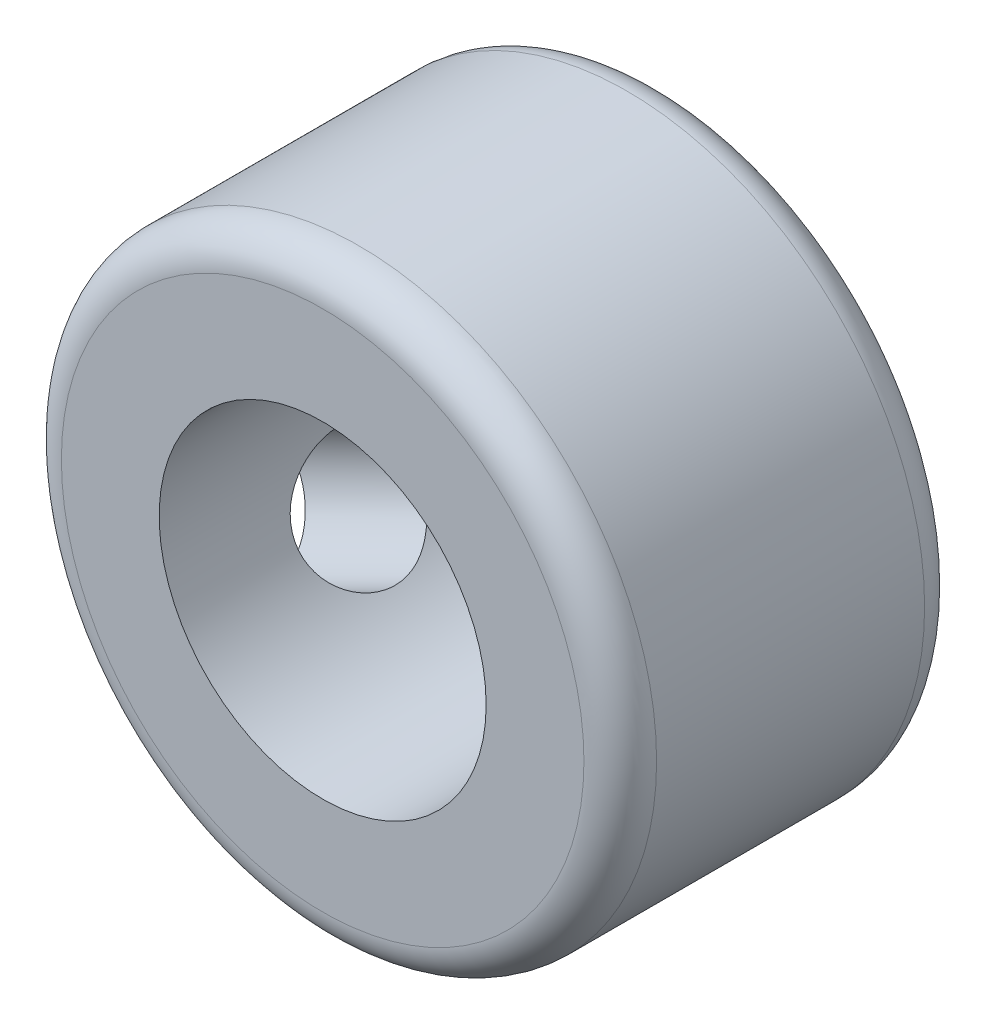
ISO-10303-21;
HEADER;
FILE_DESCRIPTION(('STEP AP214'),'2;1');
FILE_NAME('part.step','',(''),(''),'','','');
FILE_SCHEMA(('AUTOMOTIVE_DESIGN { 1 0 10303 214 1 1 1 1 }'));
ENDSEC;
DATA;
#1=APPLICATION_CONTEXT('core data for automotive mechanical design processes');
#2=APPLICATION_PROTOCOL_DEFINITION('international standard','automotive_design',2000,#1);
#3=PRODUCT_CONTEXT('',#1,'mechanical');
#4=PRODUCT('Part','Part','',(#3));
#5=PRODUCT_RELATED_PRODUCT_CATEGORY('part','',(#4));
#6=PRODUCT_DEFINITION_FORMATION('','',#4);
#7=PRODUCT_DEFINITION_CONTEXT('part definition',#1,'design');
#8=PRODUCT_DEFINITION('design','',#6,#7);
#9=PRODUCT_DEFINITION_SHAPE('','',#8);
#10=(LENGTH_UNIT() NAMED_UNIT(*) SI_UNIT(.MILLI.,.METRE.));
#11=(NAMED_UNIT(*) PLANE_ANGLE_UNIT() SI_UNIT($,.RADIAN.));
#12=(NAMED_UNIT(*) SI_UNIT($,.STERADIAN.) SOLID_ANGLE_UNIT());
#13=UNCERTAINTY_MEASURE_WITH_UNIT(LENGTH_MEASURE(1.E-05),#10,'distance_accuracy_value','');
#14=(GEOMETRIC_REPRESENTATION_CONTEXT(3) GLOBAL_UNCERTAINTY_ASSIGNED_CONTEXT((#13)) GLOBAL_UNIT_ASSIGNED_CONTEXT((#10,
#11,#12)) REPRESENTATION_CONTEXT('',''));
#15=CARTESIAN_POINT('',(0.,0.,0.));
#16=DIRECTION('',(0.,0.,1.));
#17=DIRECTION('',(1.,0.,0.));
#18=AXIS2_PLACEMENT_3D('',#15,#16,#17);
#19=CARTESIAN_POINT('',(0.,0.,7.14502));
#20=DIRECTION('',(0.,0.,1.));
#21=DIRECTION('',(1.,0.,0.));
#22=AXIS2_PLACEMENT_3D('',#19,#20,#21);
#23=PLANE('',#22);
#24=CARTESIAN_POINT('',(0.,0.,7.14502));
#25=DIRECTION('',(0.,0.,1.));
#26=DIRECTION('',(1.,0.,0.));
#27=AXIS2_PLACEMENT_3D('',#24,#25,#26);
#28=CIRCLE('',#27,5.48005);
#29=CARTESIAN_POINT('',(5.48005,0.,7.14502));
#30=VERTEX_POINT('',#29);
#31=EDGE_CURVE('E10',#30,#30,#28,.T.);
#32=ORIENTED_EDGE('',*,*,#31,.T.);
#33=EDGE_LOOP('',(#32));
#34=FACE_BOUND('',#33,.T.);
#35=CARTESIAN_POINT('',(0.,0.,7.14502));
#36=DIRECTION('',(0.,0.,1.));
#37=DIRECTION('',(1.,0.,0.));
#38=AXIS2_PLACEMENT_3D('',#35,#36,#37);
#39=CIRCLE('',#38,3.429);
#40=CARTESIAN_POINT('',(3.429,0.,7.14502));
#41=VERTEX_POINT('',#40);
#42=EDGE_CURVE('E52',#41,#41,#39,.T.);
#43=ORIENTED_EDGE('',*,*,#42,.F.);
#44=EDGE_LOOP('',(#43));
#45=FACE_BOUND('',#44,.T.);
#46=ADVANCED_FACE('F32',(#34,#45),#23,.T.);
#47=CARTESIAN_POINT('',(0.,0.,0.));
#48=DIRECTION('',(0.,0.,1.));
#49=DIRECTION('',(1.,0.,0.));
#50=AXIS2_PLACEMENT_3D('',#47,#48,#49);
#51=PLANE('',#50);
#52=CARTESIAN_POINT('',(0.,0.,0.));
#53=DIRECTION('',(0.,0.,1.));
#54=DIRECTION('',(1.,0.,0.));
#55=AXIS2_PLACEMENT_3D('',#52,#53,#54);
#56=CIRCLE('',#55,5.48005);
#57=CARTESIAN_POINT('',(5.48005,0.,0.));
#58=VERTEX_POINT('',#57);
#59=EDGE_CURVE('E39',#58,#58,#56,.F.);
#60=ORIENTED_EDGE('',*,*,#59,.T.);
#61=EDGE_LOOP('',(#60));
#62=FACE_BOUND('',#61,.T.);
#63=CARTESIAN_POINT('',(0.,0.,0.));
#64=DIRECTION('',(0.,0.,1.));
#65=DIRECTION('',(1.,0.,0.));
#66=AXIS2_PLACEMENT_3D('',#63,#64,#65);
#67=CIRCLE('',#66,3.429);
#68=CARTESIAN_POINT('',(3.429,0.,0.));
#69=VERTEX_POINT('',#68);
#70=EDGE_CURVE('E53',#69,#69,#67,.T.);
#71=ORIENTED_EDGE('',*,*,#70,.T.);
#72=EDGE_LOOP('',(#71));
#73=FACE_BOUND('',#72,.T.);
#74=ADVANCED_FACE('F87',(#62,#73),#51,.F.);
#75=CARTESIAN_POINT('',(0.,0.,7.14502));
#76=DIRECTION('',(0.,0.,-1.));
#77=DIRECTION('',(-1.,0.,0.));
#78=AXIS2_PLACEMENT_3D('',#75,#76,#77);
#79=CYLINDRICAL_SURFACE('',#78,6.24205);
#80=CARTESIAN_POINT('',(-4.89555906178153,-3.8725559615206,3.35964754371703));
#81=CARTESIAN_POINT('',(-4.89556151127646,-3.872554282031,3.28748073868206));
#82=CARTESIAN_POINT('',(-4.89939232881785,-3.86772516455889,3.21528194832226));
#83=CARTESIAN_POINT('',(-4.91450221139038,-3.84850621838423,3.07293144813282));
#84=CARTESIAN_POINT('',(-4.92578698788261,-3.83410905829038,3.00278135115123));
#85=CARTESIAN_POINT('',(-4.95515144976803,-3.7960815297565,2.86660814231961));
#86=CARTESIAN_POINT('',(-4.97322407662432,-3.77246075174592,2.80058082617589));
#87=CARTESIAN_POINT('',(-5.0152020682944,-3.71647081147953,2.67436023219772));
#88=CARTESIAN_POINT('',(-5.03910719661983,-3.68410200392124,2.6141667179604));
#89=CARTESIAN_POINT('',(-5.09193282424291,-3.6107441996903,2.50039776339189));
#90=CARTESIAN_POINT('',(-5.1209177868462,-3.56964275697667,2.44692474276671));
#91=CARTESIAN_POINT('',(-5.18230843167619,-3.47991625769416,2.34901005020034));
#92=CARTESIAN_POINT('',(-5.21471436443174,-3.43129064998442,2.30456904040099));
#93=CARTESIAN_POINT('',(-5.28184104643445,-3.32704328260817,2.22557911585089));
#94=CARTESIAN_POINT('',(-5.31658083892124,-3.27135952972142,2.19112804226269));
#95=CARTESIAN_POINT('',(-5.38663410625901,-3.15467677967938,2.13372798942026));
#96=CARTESIAN_POINT('',(-5.42194752245468,-3.0936783232248,2.11077784169936));
#97=CARTESIAN_POINT('',(-5.49127614278697,-2.96885441069911,2.07735137050192));
#98=CARTESIAN_POINT('',(-5.52530267641748,-2.9050816384348,2.06670192282013));
#99=CARTESIAN_POINT('',(-5.59142075156206,-2.77569410404554,2.05763851610217));
#100=CARTESIAN_POINT('',(-5.62351249423381,-2.71007953445303,2.05922328287226));
#101=CARTESIAN_POINT('',(-5.68437006800754,-2.57996261200605,2.07445303115628));
#102=CARTESIAN_POINT('',(-5.71317959048657,-2.51545872461515,2.08791147821499));
#103=CARTESIAN_POINT('',(-5.76743235138648,-2.38844811085704,2.12621008797153));
#104=CARTESIAN_POINT('',(-5.79287544723976,-2.32594146915784,2.15105073250482));
#105=CARTESIAN_POINT('',(-5.84021998489538,-2.20438343410889,2.21157802834788));
#106=CARTESIAN_POINT('',(-5.86209637041905,-2.14535820153378,2.24733673368159));
#107=CARTESIAN_POINT('',(-5.90200013783265,-2.03301303102962,2.32863160275434));
#108=CARTESIAN_POINT('',(-5.92002704093151,-1.97969380321319,2.37416898133452));
#109=CARTESIAN_POINT('',(-5.95261128199984,-1.87947880535448,2.4747485606788));
#110=CARTESIAN_POINT('',(-5.96709666595797,-1.83272336252475,2.52995402335311));
#111=CARTESIAN_POINT('',(-5.9923382394645,-1.7484314171397,2.64776553136598));
#112=CARTESIAN_POINT('',(-6.00309434605521,-1.71089511966948,2.71037174129247));
#113=CARTESIAN_POINT('',(-6.02112717400421,-1.64631349479915,2.84144626419913));
#114=CARTESIAN_POINT('',(-6.02839520738967,-1.61929439453963,2.90992871905162));
#115=CARTESIAN_POINT('',(-6.03961367720531,-1.57694001227056,3.0506728750738));
#116=CARTESIAN_POINT('',(-6.0435645860549,-1.56160306653663,3.12293403652859));
#117=CARTESIAN_POINT('',(-6.04823523901426,-1.5434138086052,3.26775019727472));
#118=CARTESIAN_POINT('',(-6.04901348520437,-1.54033547948423,3.34027495436418));
#119=CARTESIAN_POINT('',(-6.04752566605425,-1.54616632516086,3.48480582407927));
#120=CARTESIAN_POINT('',(-6.04525978893094,-1.55507475882179,3.55681196849377));
#121=CARTESIAN_POINT('',(-6.03765037231767,-1.58435750736785,3.69748166850601));
#122=CARTESIAN_POINT('',(-6.03233952755465,-1.60460996563629,3.76617245830743));
#123=CARTESIAN_POINT('',(-6.01851134926159,-1.6557191527901,3.8991431618127));
#124=CARTESIAN_POINT('',(-6.00999373284155,-1.68657681720817,3.9634226857787));
#125=CARTESIAN_POINT('',(-5.98940533365221,-1.75829981031248,4.08674140592178));
#126=CARTESIAN_POINT('',(-5.97728628386192,-1.79929972821048,4.14569423034264));
#127=CARTESIAN_POINT('',(-5.94932966390241,-1.88968181758753,4.25577824880108));
#128=CARTESIAN_POINT('',(-5.9334916770325,-1.93906492821744,4.30690856527858));
#129=CARTESIAN_POINT('',(-5.89764823398908,-2.0455155868203,4.40077144659245));
#130=CARTESIAN_POINT('',(-5.87757739338311,-2.10269803198287,4.44334894026558));
#131=CARTESIAN_POINT('',(-5.83342360874218,-2.22225379898614,4.51779377005767));
#132=CARTESIAN_POINT('',(-5.8093408419806,-2.28462689140886,4.54966157921355));
#133=CARTESIAN_POINT('',(-5.75753321870572,-2.4121994308606,4.6015607182477));
#134=CARTESIAN_POINT('',(-5.72983136993394,-2.47737941200989,4.62166275901407));
#135=CARTESIAN_POINT('',(-5.67116586807328,-2.60887803237933,4.64968247852203));
#136=CARTESIAN_POINT('',(-5.64020264325804,-2.67519652113928,4.65760175493985));
#137=CARTESIAN_POINT('',(-5.57641575798782,-2.8056999652772,4.66096496177949));
#138=CARTESIAN_POINT('',(-5.54363819022821,-2.86990157069485,4.65664132525036));
#139=CARTESIAN_POINT('',(-5.47671282305758,-2.99564327647339,4.6361575316094));
#140=CARTESIAN_POINT('',(-5.44256504395452,-3.05718341625191,4.61999754986337));
#141=CARTESIAN_POINT('',(-5.37419121563277,-3.17583646504283,4.57640665668795));
#142=CARTESIAN_POINT('',(-5.33996561663927,-3.23296072153121,4.54900585821135));
#143=CARTESIAN_POINT('',(-5.27264801500482,-3.34162555577781,4.48374166827042));
#144=CARTESIAN_POINT('',(-5.23955611127441,-3.39316564718325,4.44587736650547));
#145=CARTESIAN_POINT('',(-5.17530073534086,-3.49040252928673,4.35998818957931));
#146=CARTESIAN_POINT('',(-5.14418075206696,-3.53598225227065,4.31179822746916));
#147=CARTESIAN_POINT('',(-5.08590405098134,-3.61930374729544,4.20696224804262));
#148=CARTESIAN_POINT('',(-5.0587482798609,-3.65704364802003,4.15031421737171));
#149=CARTESIAN_POINT('',(-5.00942865320613,-3.72432251391559,4.02936249043176));
#150=CARTESIAN_POINT('',(-4.98732787378027,-3.753758823153,3.96497590752718));
#151=CARTESIAN_POINT('',(-4.94973576260537,-3.80319288505781,3.83091159021136));
#152=CARTESIAN_POINT('',(-4.93423860778763,-3.82319895495986,3.76123858150894));
#153=CARTESIAN_POINT('',(-4.91360522243457,-3.84965906237777,3.63614458969436));
#154=CARTESIAN_POINT('',(-4.90685957827449,-3.85823411465976,3.58142266905371));
#155=CARTESIAN_POINT('',(-4.89783564251892,-3.86968309771862,3.4710226718279));
#156=CARTESIAN_POINT('',(-4.89555717130378,-3.87255725772157,3.41534463377788));
#157=CARTESIAN_POINT('',(-4.89555906178153,-3.8725559615206,3.35964754371703));
#158=B_SPLINE_CURVE_WITH_KNOTS('',3,(#80,#81,#82,#83,#84,#85,#86,#87,#88,#89,#90,#91,#92,#93,
#94,#95,#96,#97,#98,#99,#100,#101,#102,#103,#104,#105,#106,#107,#108,#109,#110,#111,#112,#113,
#114,#115,#116,#117,#118,#119,#120,#121,#122,#123,#124,#125,#126,#127,#128,#129,#130,#131,#132,
#133,#134,#135,#136,#137,#138,#139,#140,#141,#142,#143,#144,#145,#146,#147,#148,#149,#150,#151,
#152,#153,#154,#155,#156,#157),.UNSPECIFIED.,.T.,.F.,(4,2,2,2,2,2,2,2,2,2,2,2,2,2,2,2,2,2,2,2,2,
2,2,2,2,2,2,2,2,2,2,2,2,2,2,2,2,2,4),(0.,0.216296401042701,0.432758727840282,0.648996580631314,
0.865225667159785,1.08442897131557,1.3036483395978,1.5249473404376,1.74622385326547,
1.96434656690035,2.18244656335566,2.39718005151517,2.61192263069345,2.82811421723303,
3.04433267761608,3.26463453307644,3.48494128883226,3.7057939652596,3.92661518287352,
4.14334564382506,4.36006270503604,4.57449526015904,4.78894673619443,5.00641296606696,
5.22390357430526,5.44503851773163,5.66616369254684,5.88594591089351,6.10569930402802,
6.32130878149514,6.5369150645843,6.75194749441027,6.96699863745356,7.18578575589877,
7.40462503759842,7.62606178264249,7.84730285890275,8.01424338718197,8.1811772028452),.UNSPECIFIED.);
#159=CARTESIAN_POINT('',(-4.89555906178153,-3.8725559615206,3.35964754371703));
#160=VERTEX_POINT('',#159);
#161=EDGE_CURVE('E56',#160,#160,#158,.T.);
#162=ORIENTED_EDGE('',*,*,#161,.T.);
#163=EDGE_LOOP('',(#162));
#164=FACE_BOUND('',#163,.T.);
#165=CARTESIAN_POINT('',(0.,0.,0.762));
#166=DIRECTION('',(0.,0.,1.));
#167=DIRECTION('',(1.,0.,0.));
#168=AXIS2_PLACEMENT_3D('',#165,#166,#167);
#169=CIRCLE('',#168,6.24205);
#170=CARTESIAN_POINT('',(6.24205,0.,0.762));
#171=VERTEX_POINT('',#170);
#172=EDGE_CURVE('E43',#171,#171,#169,.T.);
#173=ORIENTED_EDGE('',*,*,#172,.T.);
#174=EDGE_LOOP('',(#173));
#175=FACE_BOUND('',#174,.T.);
#176=CARTESIAN_POINT('',(0.,0.,6.38302));
#177=DIRECTION('',(0.,0.,1.));
#178=DIRECTION('',(1.,0.,0.));
#179=AXIS2_PLACEMENT_3D('',#176,#177,#178);
#180=CIRCLE('',#179,6.24205);
#181=CARTESIAN_POINT('',(6.24205,0.,6.38302));
#182=VERTEX_POINT('',#181);
#183=EDGE_CURVE('E47',#182,#182,#180,.F.);
#184=ORIENTED_EDGE('',*,*,#183,.T.);
#185=EDGE_LOOP('',(#184));
#186=FACE_BOUND('',#185,.T.);
#187=ADVANCED_FACE('F71',(#164,#175,#186),#79,.T.);
#188=CARTESIAN_POINT('',(0.,0.,7.14502));
#189=DIRECTION('',(0.,0.,-1.));
#190=DIRECTION('',(-1.,0.,0.));
#191=AXIS2_PLACEMENT_3D('',#188,#189,#190);
#192=CYLINDRICAL_SURFACE('',#191,3.429);
#193=CARTESIAN_POINT('',(-2.26747407947061,-2.57227570429939,3.35964754371703));
#194=CARTESIAN_POINT('',(-2.26747030842872,-2.57227709940115,3.28950484390039));
#195=CARTESIAN_POINT('',(-2.27210714909908,-2.5682132239097,3.21938114689891));
#196=CARTESIAN_POINT('',(-2.29025132017933,-2.55204548218884,3.08125166189923));
#197=CARTESIAN_POINT('',(-2.30375823350285,-2.53994199399581,3.0132457744754));
#198=CARTESIAN_POINT('',(-2.33854743676144,-2.50794490039064,2.88138663583295));
#199=CARTESIAN_POINT('',(-2.35981072047008,-2.48807032877012,2.81752367953077));
#200=CARTESIAN_POINT('',(-2.40868240703513,-2.44078727640553,2.69524959509066));
#201=CARTESIAN_POINT('',(-2.43629275953771,-2.41337648023102,2.6368401498904));
#202=CARTESIAN_POINT('',(-2.49765471723843,-2.34985035411838,2.52416232244925));
#203=CARTESIAN_POINT('',(-2.53163119253578,-2.31339124926917,2.47021013305066));
#204=CARTESIAN_POINT('',(-2.60293153967425,-2.23286320335768,2.37085487488544));
#205=CARTESIAN_POINT('',(-2.64025614333647,-2.18879259664491,2.32545368191773));
#206=CARTESIAN_POINT('',(-2.71773540027253,-2.09187262124716,2.24295650017647));
#207=CARTESIAN_POINT('',(-2.75794335785931,-2.03877062001819,2.20620552571719));
#208=CARTESIAN_POINT('',(-2.83792910271802,-1.92587002109268,2.14436342783691));
#209=CARTESIAN_POINT('',(-2.87770703782665,-1.86607381062406,2.11926816419621));
#210=CARTESIAN_POINT('',(-2.95322634739953,-1.74396640083232,2.08256277335286));
#211=CARTESIAN_POINT('',(-2.98906831525229,-1.68188155114414,2.07040799382833));
#212=CARTESIAN_POINT('',(-3.05717487121117,-1.55464549717725,2.05818205740226));
#213=CARTESIAN_POINT('',(-3.08944064470829,-1.48949531921581,2.05810688446549));
#214=CARTESIAN_POINT('',(-3.14785107348823,-1.36153406787455,2.0697281173022));
#215=CARTESIAN_POINT('',(-3.17422269913715,-1.29877122619699,2.08082967563692));
#216=CARTESIAN_POINT('',(-3.22237566729219,-1.1742215638033,2.11348681492332));
#217=CARTESIAN_POINT('',(-3.24415668381279,-1.11243481268871,2.13504313792375));
#218=CARTESIAN_POINT('',(-3.28338077333767,-0.990757932919237,2.18826719822349));
#219=CARTESIAN_POINT('',(-3.30075559008604,-0.930908873472572,2.22007849972881));
#220=CARTESIAN_POINT('',(-3.33108052408566,-0.815777634892501,2.29278130487117));
#221=CARTESIAN_POINT('',(-3.34402919371209,-0.760496954376234,2.3336757720663));
#222=CARTESIAN_POINT('',(-3.36673220498142,-0.652958311756335,2.4262355387693));
#223=CARTESIAN_POINT('',(-3.37624980814135,-0.601077601637,2.47839796486429));
#224=CARTESIAN_POINT('',(-3.39180823447309,-0.505969974224323,2.59057042011697));
#225=CARTESIAN_POINT('',(-3.39784814495695,-0.462745330574132,2.65058250427769));
#226=CARTESIAN_POINT('',(-3.40745577216126,-0.38578494560052,2.77853632089886));
#227=CARTESIAN_POINT('',(-3.41096309527068,-0.352291725955157,2.84662932320014));
#228=CARTESIAN_POINT('',(-3.41614744830987,-0.297881817307615,2.98772726601331));
#229=CARTESIAN_POINT('',(-3.41782552424842,-0.276957943918749,3.06072937399295));
#230=CARTESIAN_POINT('',(-3.41992057242502,-0.249722962608799,3.20518700053376));
#231=CARTESIAN_POINT('',(-3.42040307757978,-0.242657172894765,3.27649911913703));
#232=CARTESIAN_POINT('',(-3.42050198542265,-0.241266290139215,3.4192385565834));
#233=CARTESIAN_POINT('',(-3.42011861150782,-0.246937910839832,3.49066584096246));
#234=CARTESIAN_POINT('',(-3.41836484617287,-0.270081466137236,3.627942351259));
#235=CARTESIAN_POINT('',(-3.41704368174664,-0.286962259342676,3.69389348448609));
#236=CARTESIAN_POINT('',(-3.41305161392389,-0.331068691412498,3.82219035413684));
#237=CARTESIAN_POINT('',(-3.41038043026801,-0.358296477986002,3.88453533894025));
#238=CARTESIAN_POINT('',(-3.40295341719503,-0.423142600645084,4.00648713738159));
#239=CARTESIAN_POINT('',(-3.39812219949659,-0.46111658863015,4.06589975938463));
#240=CARTESIAN_POINT('',(-3.38559856683993,-0.54550973849413,4.1780608540603));
#241=CARTESIAN_POINT('',(-3.37790508390184,-0.591932049338231,4.23080682939278));
#242=CARTESIAN_POINT('',(-3.35826936370743,-0.694974346283289,4.33169774799338));
#243=CARTESIAN_POINT('',(-3.34608330117401,-0.752061253500244,4.37932020363114));
#244=CARTESIAN_POINT('',(-3.31679110427455,-0.87221355611712,4.46446165808167));
#245=CARTESIAN_POINT('',(-3.29968492738867,-0.935279003180698,4.50198056957372));
#246=CARTESIAN_POINT('',(-3.26008288300493,-1.06512354355151,4.56561813070751));
#247=CARTESIAN_POINT('',(-3.23760336841212,-1.13189090606928,4.59177070425396));
#248=CARTESIAN_POINT('',(-3.18715115261084,-1.26700328841857,4.63180965104158));
#249=CARTESIAN_POINT('',(-3.15918110516235,-1.335347532063,4.64570193233887));
#250=CARTESIAN_POINT('',(-3.1000617057627,-1.46716249340065,4.66017841322985));
#251=CARTESIAN_POINT('',(-3.06920003413211,-1.53068148491115,4.66150434909939));
#252=CARTESIAN_POINT('',(-3.00395676004415,-1.65505713492336,4.6527266340656));
#253=CARTESIAN_POINT('',(-2.96957559860035,-1.71591412562932,4.6426244135895));
#254=CARTESIAN_POINT('',(-2.89947234074163,-1.83182360225129,4.6117998476018));
#255=CARTESIAN_POINT('',(-2.86380640121553,-1.88698418603053,4.59135346707571));
#256=CARTESIAN_POINT('',(-2.79172607793569,-1.99207708949328,4.54069812907696));
#257=CARTESIAN_POINT('',(-2.75531155365101,-2.04200841657181,4.51048732257532));
#258=CARTESIAN_POINT('',(-2.68168620393303,-2.13785113701048,4.43970394703373));
#259=CARTESIAN_POINT('',(-2.64450718713281,-2.18350193460519,4.39874598642105));
#260=CARTESIAN_POINT('',(-2.57265562102337,-2.26771994676495,4.30823396638923));
#261=CARTESIAN_POINT('',(-2.53798398046439,-2.30628460081905,4.25867681226003));
#262=CARTESIAN_POINT('',(-2.47111626801636,-2.37784666240351,4.14917992632863));
#263=CARTESIAN_POINT('',(-2.43915639465308,-2.41042877044321,4.08882290338991));
#264=CARTESIAN_POINT('',(-2.38197617098747,-2.46695216493545,3.96122923617527));
#265=CARTESIAN_POINT('',(-2.35675681057706,-2.49089218241675,3.89399158343311));
#266=CARTESIAN_POINT('',(-2.31383307883098,-2.5308363507088,3.75064972617516));
#267=CARTESIAN_POINT('',(-2.29660136218249,-2.54634903569742,3.67426387271674));
#268=CARTESIAN_POINT('',(-2.27342795959135,-2.56706430395349,3.51845829899826));
#269=CARTESIAN_POINT('',(-2.26747834784212,-2.5722741252099,3.43904074858084));
#270=CARTESIAN_POINT('',(-2.26747407947061,-2.57227570429939,3.35964754371703));
#271=B_SPLINE_CURVE_WITH_KNOTS('',3,(#193,#194,#195,#196,#197,#198,#199,#200,#201,#202,#203,
#204,#205,#206,#207,#208,#209,#210,#211,#212,#213,#214,#215,#216,#217,#218,#219,#220,#221,#222,
#223,#224,#225,#226,#227,#228,#229,#230,#231,#232,#233,#234,#235,#236,#237,#238,#239,#240,#241,
#242,#243,#244,#245,#246,#247,#248,#249,#250,#251,#252,#253,#254,#255,#256,#257,#258,#259,#260,
#261,#262,#263,#264,#265,#266,#267,#268,#269,#270),.UNSPECIFIED.,.T.,.F.,(4,2,2,2,2,2,2,2,2,2,2,
2,2,2,2,2,2,2,2,2,2,2,2,2,2,2,2,2,2,2,2,2,2,2,2,2,2,2,4),(0.,0.210132294663077,
0.420254709244839,0.629865660680397,0.839541085114387,1.05890800418601,1.2783229890216,
1.50539294803656,1.73238218783375,1.94938610014063,2.16631786629339,2.37228398569114,
2.57826472610427,2.78726435458816,2.99633227366336,3.21787655813145,3.43947895835685,
3.666205446463,3.89280221863505,4.10667291615206,4.32048844126784,4.52383897283673,
4.72723173663078,4.93835655283881,5.14956022391968,5.37450261583406,5.5994469517693,
5.82371523104652,6.04787537960572,6.25871554669641,6.46952932649074,6.67499418783829,
6.88049797961447,7.0947247405698,7.30902875876427,7.53495389467216,7.76091219107435,
7.99892425799089,8.2367690566984),.UNSPECIFIED.);
#272=CARTESIAN_POINT('',(-2.26747407947061,-2.57227570429939,3.35964754371703));
#273=VERTEX_POINT('',#272);
#274=EDGE_CURVE('E66',#273,#273,#271,.T.);
#275=ORIENTED_EDGE('',*,*,#274,.F.);
#276=EDGE_LOOP('',(#275));
#277=FACE_BOUND('',#276,.T.);
#278=ORIENTED_EDGE('',*,*,#42,.T.);
#279=EDGE_LOOP('',(#278));
#280=FACE_BOUND('',#279,.T.);
#281=ORIENTED_EDGE('',*,*,#70,.F.);
#282=EDGE_LOOP('',(#281));
#283=FACE_BOUND('',#282,.T.);
#284=ADVANCED_FACE('F81',(#277,#280,#283),#192,.F.);
#285=CARTESIAN_POINT('',(0.,0.,0.762));
#286=DIRECTION('',(0.,0.,1.));
#287=DIRECTION('',(1.,0.,0.));
#288=AXIS2_PLACEMENT_3D('',#285,#286,#287);
#289=TOROIDAL_SURFACE('',#288,5.48005,0.762);
#290=ORIENTED_EDGE('',*,*,#59,.F.);
#291=EDGE_LOOP('',(#290));
#292=FACE_BOUND('',#291,.T.);
#293=ORIENTED_EDGE('',*,*,#172,.F.);
#294=EDGE_LOOP('',(#293));
#295=FACE_BOUND('',#294,.T.);
#296=ADVANCED_FACE('F84',(#292,#295),#289,.T.);
#297=CARTESIAN_POINT('',(0.,0.,6.38302));
#298=DIRECTION('',(0.,0.,1.));
#299=DIRECTION('',(1.,0.,0.));
#300=AXIS2_PLACEMENT_3D('',#297,#298,#299);
#301=TOROIDAL_SURFACE('',#300,5.48005,0.762);
#302=ORIENTED_EDGE('',*,*,#183,.F.);
#303=EDGE_LOOP('',(#302));
#304=FACE_BOUND('',#303,.T.);
#305=ORIENTED_EDGE('',*,*,#31,.F.);
#306=EDGE_LOOP('',(#305));
#307=FACE_BOUND('',#306,.T.);
#308=ADVANCED_FACE('F34',(#304,#307),#301,.T.);
#309=CARTESIAN_POINT('',(-5.59472899743619,-2.76806713208814,3.35964754371703));
#310=DIRECTION('',(-0.896296729029116,-0.443454815659621,0.));
#311=DIRECTION('',(0.443454815659621,-0.896296729029116,0.));
#312=AXIS2_PLACEMENT_3D('',#309,#310,#311);
#313=CYLINDRICAL_SURFACE('',#312,1.29999999999999);
#314=ORIENTED_EDGE('',*,*,#274,.T.);
#315=EDGE_LOOP('',(#314));
#316=FACE_BOUND('',#315,.T.);
#317=ORIENTED_EDGE('',*,*,#161,.F.);
#318=EDGE_LOOP('',(#317));
#319=FACE_BOUND('',#318,.T.);
#320=ADVANCED_FACE('F74',(#316,#319),#313,.F.);
#321=CLOSED_SHELL('',(#46,#74,#187,#284,#296,#308,#320));
#322=MANIFOLD_SOLID_BREP('B2',#321);
#323=ADVANCED_BREP_SHAPE_REPRESENTATION('',(#18,#322),#14);
#324=SHAPE_DEFINITION_REPRESENTATION(#9,#323);
ENDSEC;
END-ISO-10303-21;
